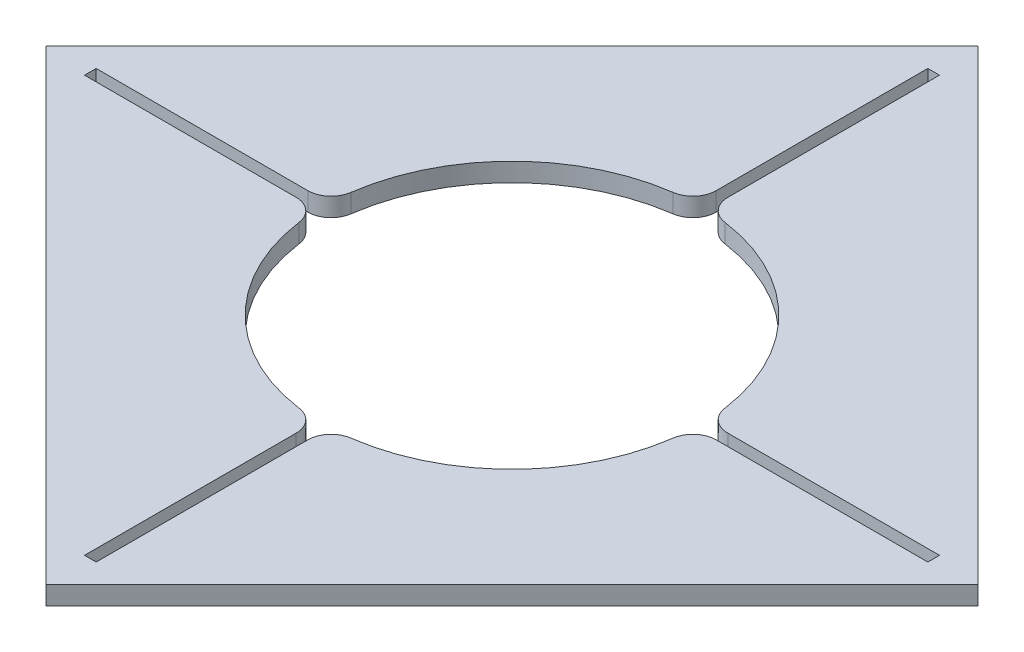
ISO-10303-21;
HEADER;
FILE_DESCRIPTION(('STEP AP214'),'2;1');
FILE_NAME('part.step','',(''),(''),'','','');
FILE_SCHEMA(('AUTOMOTIVE_DESIGN { 1 0 10303 214 1 1 1 1 }'));
ENDSEC;
DATA;
#1=APPLICATION_CONTEXT('core data for automotive mechanical design processes');
#2=APPLICATION_PROTOCOL_DEFINITION('international standard','automotive_design',2000,#1);
#3=PRODUCT_CONTEXT('',#1,'mechanical');
#4=PRODUCT('Part','Part','',(#3));
#5=PRODUCT_RELATED_PRODUCT_CATEGORY('part','',(#4));
#6=PRODUCT_DEFINITION_FORMATION('','',#4);
#7=PRODUCT_DEFINITION_CONTEXT('part definition',#1,'design');
#8=PRODUCT_DEFINITION('design','',#6,#7);
#9=PRODUCT_DEFINITION_SHAPE('','',#8);
#10=(LENGTH_UNIT() NAMED_UNIT(*) SI_UNIT(.MILLI.,.METRE.));
#11=(NAMED_UNIT(*) PLANE_ANGLE_UNIT() SI_UNIT($,.RADIAN.));
#12=(NAMED_UNIT(*) SI_UNIT($,.STERADIAN.) SOLID_ANGLE_UNIT());
#13=UNCERTAINTY_MEASURE_WITH_UNIT(LENGTH_MEASURE(1.E-05),#10,'distance_accuracy_value','');
#14=(GEOMETRIC_REPRESENTATION_CONTEXT(3) GLOBAL_UNCERTAINTY_ASSIGNED_CONTEXT((#13)) GLOBAL_UNIT_ASSIGNED_CONTEXT((#10,
#11,#12)) REPRESENTATION_CONTEXT('',''));
#15=CARTESIAN_POINT('',(0.,0.,0.));
#16=DIRECTION('',(0.,0.,1.));
#17=DIRECTION('',(1.,0.,0.));
#18=AXIS2_PLACEMENT_3D('',#15,#16,#17);
#19=CARTESIAN_POINT('',(0.,5.08,0.));
#20=DIRECTION('',(0.,-1.,0.));
#21=DIRECTION('',(0.,0.,-1.));
#22=AXIS2_PLACEMENT_3D('',#19,#20,#21);
#23=CYLINDRICAL_SURFACE('',#22,51.435);
#24=CARTESIAN_POINT('',(0.,0.,0.));
#25=DIRECTION('',(0.,1.,0.));
#26=DIRECTION('',(0.,0.,1.));
#27=AXIS2_PLACEMENT_3D('',#24,#25,#26);
#28=CIRCLE('',#27,51.435);
#29=CARTESIAN_POINT('',(7.06524725274725,0.,50.9474386623856));
#30=VERTEX_POINT('',#29);
#31=CARTESIAN_POINT('',(50.9474386623856,0.,7.06524725274726));
#32=VERTEX_POINT('',#31);
#33=EDGE_CURVE('E270',#30,#32,#28,.T.);
#34=ORIENTED_EDGE('',*,*,#33,.F.);
#35=DIRECTION('',(0.,-1.,0.));
#36=VECTOR('',#35,1.);
#37=CARTESIAN_POINT('',(7.06524725274725,5.08,50.9474386623856));
#38=LINE('',#37,#36);
#39=CARTESIAN_POINT('',(7.06524725274725,5.08,50.9474386623856));
#40=VERTEX_POINT('',#39);
#41=EDGE_CURVE('E11',#40,#30,#38,.T.);
#42=ORIENTED_EDGE('',*,*,#41,.F.);
#43=CARTESIAN_POINT('',(0.,5.08,0.));
#44=DIRECTION('',(0.,1.,0.));
#45=DIRECTION('',(0.,0.,1.));
#46=AXIS2_PLACEMENT_3D('',#43,#44,#45);
#47=CIRCLE('',#46,51.435);
#48=CARTESIAN_POINT('',(50.9474386623856,5.08,7.06524725274726));
#49=VERTEX_POINT('',#48);
#50=EDGE_CURVE('E405',#40,#49,#47,.T.);
#51=ORIENTED_EDGE('',*,*,#50,.T.);
#52=DIRECTION('',(0.,-1.,0.));
#53=VECTOR('',#52,1.);
#54=CARTESIAN_POINT('',(50.9474386623856,5.08,7.06524725274726));
#55=LINE('',#54,#53);
#56=EDGE_CURVE('E147',#49,#32,#55,.T.);
#57=ORIENTED_EDGE('',*,*,#56,.T.);
#58=EDGE_LOOP('',(#34,#42,#51,#57));
#59=FACE_BOUND('',#58,.T.);
#60=ADVANCED_FACE('F33',(#59),#23,.F.);
#61=CARTESIAN_POINT('',(7.9375,5.08,57.2372459046555));
#62=DIRECTION('',(0.,-1.,0.));
#63=DIRECTION('',(0.,0.,-1.));
#64=AXIS2_PLACEMENT_3D('',#61,#62,#63);
#65=CYLINDRICAL_SURFACE('',#64,6.35);
#66=CARTESIAN_POINT('',(7.9375,0.,57.2372459046555));
#67=DIRECTION('',(0.,1.,0.));
#68=DIRECTION('',(0.,0.,1.));
#69=AXIS2_PLACEMENT_3D('',#66,#67,#68);
#70=CIRCLE('',#69,6.35);
#71=CARTESIAN_POINT('',(1.5875,0.,57.2372459046555));
#72=VERTEX_POINT('',#71);
#73=EDGE_CURVE('E272',#30,#72,#70,.T.);
#74=ORIENTED_EDGE('',*,*,#73,.T.);
#75=DIRECTION('',(0.,-1.,0.));
#76=VECTOR('',#75,1.);
#77=CARTESIAN_POINT('',(1.5875,5.08,57.2372459046555));
#78=LINE('',#77,#76);
#79=CARTESIAN_POINT('',(1.5875,5.08,57.2372459046555));
#80=VERTEX_POINT('',#79);
#81=EDGE_CURVE('E43',#80,#72,#78,.T.);
#82=ORIENTED_EDGE('',*,*,#81,.F.);
#83=CARTESIAN_POINT('',(7.9375,5.08,57.2372459046555));
#84=DIRECTION('',(0.,1.,0.));
#85=DIRECTION('',(0.,0.,1.));
#86=AXIS2_PLACEMENT_3D('',#83,#84,#85);
#87=CIRCLE('',#86,6.35);
#88=EDGE_CURVE('E407',#40,#80,#87,.T.);
#89=ORIENTED_EDGE('',*,*,#88,.F.);
#90=ORIENTED_EDGE('',*,*,#41,.T.);
#91=EDGE_LOOP('',(#74,#82,#89,#90));
#92=FACE_BOUND('',#91,.T.);
#93=ADVANCED_FACE('F479',(#92),#65,.T.);
#94=CARTESIAN_POINT('',(1.58749999999997,5.08,0.));
#95=DIRECTION('',(-1.,0.,0.));
#96=DIRECTION('',(0.,0.,1.));
#97=AXIS2_PLACEMENT_3D('',#94,#95,#96);
#98=PLANE('',#97);
#99=DIRECTION('',(0.,0.,-1.));
#100=VECTOR('',#99,1.);
#101=CARTESIAN_POINT('',(1.58749999999997,0.,0.));
#102=LINE('',#101,#100);
#103=CARTESIAN_POINT('',(1.58750000000003,0.,114.91049570613));
#104=VERTEX_POINT('',#103);
#105=EDGE_CURVE('E275',#104,#72,#102,.T.);
#106=ORIENTED_EDGE('',*,*,#105,.F.);
#107=DIRECTION('',(0.,-1.,0.));
#108=VECTOR('',#107,1.);
#109=CARTESIAN_POINT('',(1.58750000000003,5.08,114.91049570613));
#110=LINE('',#109,#108);
#111=CARTESIAN_POINT('',(1.58750000000003,5.08,114.91049570613));
#112=VERTEX_POINT('',#111);
#113=EDGE_CURVE('E377',#112,#104,#110,.T.);
#114=ORIENTED_EDGE('',*,*,#113,.F.);
#115=DIRECTION('',(0.,0.,-1.));
#116=VECTOR('',#115,1.);
#117=CARTESIAN_POINT('',(1.58749999999997,5.08,0.));
#118=LINE('',#117,#116);
#119=EDGE_CURVE('E412',#112,#80,#118,.T.);
#120=ORIENTED_EDGE('',*,*,#119,.T.);
#121=ORIENTED_EDGE('',*,*,#81,.T.);
#122=EDGE_LOOP('',(#106,#114,#120,#121));
#123=FACE_BOUND('',#122,.T.);
#124=ADVANCED_FACE('F484',(#123),#98,.T.);
#125=CARTESIAN_POINT('',(0.,5.08,114.91049570613));
#126=DIRECTION('',(0.,0.,-1.));
#127=DIRECTION('',(-1.,0.,0.));
#128=AXIS2_PLACEMENT_3D('',#125,#126,#127);
#129=PLANE('',#128);
#130=DIRECTION('',(1.,0.,0.));
#131=VECTOR('',#130,1.);
#132=CARTESIAN_POINT('',(0.,0.,114.91049570613));
#133=LINE('',#132,#131);
#134=CARTESIAN_POINT('',(-1.58749999999997,0.,114.91049570613));
#135=VERTEX_POINT('',#134);
#136=EDGE_CURVE('E278',#135,#104,#133,.T.);
#137=ORIENTED_EDGE('',*,*,#136,.F.);
#138=DIRECTION('',(0.,-1.,0.));
#139=VECTOR('',#138,1.);
#140=CARTESIAN_POINT('',(-1.58749999999997,5.08,114.91049570613));
#141=LINE('',#140,#139);
#142=CARTESIAN_POINT('',(-1.58749999999997,5.08,114.91049570613));
#143=VERTEX_POINT('',#142);
#144=EDGE_CURVE('E375',#143,#135,#141,.T.);
#145=ORIENTED_EDGE('',*,*,#144,.F.);
#146=DIRECTION('',(1.,0.,0.));
#147=VECTOR('',#146,1.);
#148=CARTESIAN_POINT('',(0.,5.08,114.91049570613));
#149=LINE('',#148,#147);
#150=EDGE_CURVE('E415',#143,#112,#149,.T.);
#151=ORIENTED_EDGE('',*,*,#150,.T.);
#152=ORIENTED_EDGE('',*,*,#113,.T.);
#153=EDGE_LOOP('',(#137,#145,#151,#152));
#154=FACE_BOUND('',#153,.T.);
#155=ADVANCED_FACE('F568',(#154),#129,.T.);
#156=CARTESIAN_POINT('',(-1.58750000000003,5.08,0.));
#157=DIRECTION('',(-1.,0.,0.));
#158=DIRECTION('',(0.,0.,1.));
#159=AXIS2_PLACEMENT_3D('',#156,#157,#158);
#160=PLANE('',#159);
#161=DIRECTION('',(0.,0.,-1.));
#162=VECTOR('',#161,1.);
#163=CARTESIAN_POINT('',(-1.58750000000003,0.,0.));
#164=LINE('',#163,#162);
#165=CARTESIAN_POINT('',(-1.5875,0.,57.2372459046555));
#166=VERTEX_POINT('',#165);
#167=EDGE_CURVE('E281',#135,#166,#164,.T.);
#168=ORIENTED_EDGE('',*,*,#167,.T.);
#169=DIRECTION('',(0.,-1.,0.));
#170=VECTOR('',#169,1.);
#171=CARTESIAN_POINT('',(-1.5875,5.08,57.2372459046555));
#172=LINE('',#171,#170);
#173=CARTESIAN_POINT('',(-1.5875,5.08,57.2372459046555));
#174=VERTEX_POINT('',#173);
#175=EDGE_CURVE('E372',#174,#166,#172,.T.);
#176=ORIENTED_EDGE('',*,*,#175,.F.);
#177=DIRECTION('',(0.,0.,-1.));
#178=VECTOR('',#177,1.);
#179=CARTESIAN_POINT('',(-1.58750000000003,5.08,0.));
#180=LINE('',#179,#178);
#181=EDGE_CURVE('E418',#143,#174,#180,.T.);
#182=ORIENTED_EDGE('',*,*,#181,.F.);
#183=ORIENTED_EDGE('',*,*,#144,.T.);
#184=EDGE_LOOP('',(#168,#176,#182,#183));
#185=FACE_BOUND('',#184,.T.);
#186=ADVANCED_FACE('F564',(#185),#160,.F.);
#187=CARTESIAN_POINT('',(-7.9375,5.08,57.2372459046555));
#188=DIRECTION('',(0.,-1.,0.));
#189=DIRECTION('',(0.,0.,-1.));
#190=AXIS2_PLACEMENT_3D('',#187,#188,#189);
#191=CYLINDRICAL_SURFACE('',#190,6.35);
#192=CARTESIAN_POINT('',(-7.9375,0.,57.2372459046555));
#193=DIRECTION('',(0.,1.,0.));
#194=DIRECTION('',(0.,0.,1.));
#195=AXIS2_PLACEMENT_3D('',#192,#193,#194);
#196=CIRCLE('',#195,6.35);
#197=CARTESIAN_POINT('',(-7.06524725274727,0.,50.9474386623856));
#198=VERTEX_POINT('',#197);
#199=EDGE_CURVE('E284',#166,#198,#196,.T.);
#200=ORIENTED_EDGE('',*,*,#199,.T.);
#201=DIRECTION('',(0.,-1.,0.));
#202=VECTOR('',#201,1.);
#203=CARTESIAN_POINT('',(-7.06524725274727,5.08,50.9474386623856));
#204=LINE('',#203,#202);
#205=CARTESIAN_POINT('',(-7.06524725274727,5.08,50.9474386623856));
#206=VERTEX_POINT('',#205);
#207=EDGE_CURVE('E370',#206,#198,#204,.T.);
#208=ORIENTED_EDGE('',*,*,#207,.F.);
#209=CARTESIAN_POINT('',(-7.9375,5.08,57.2372459046555));
#210=DIRECTION('',(0.,1.,0.));
#211=DIRECTION('',(0.,0.,1.));
#212=AXIS2_PLACEMENT_3D('',#209,#210,#211);
#213=CIRCLE('',#212,6.35);
#214=EDGE_CURVE('E421',#174,#206,#213,.T.);
#215=ORIENTED_EDGE('',*,*,#214,.F.);
#216=ORIENTED_EDGE('',*,*,#175,.T.);
#217=EDGE_LOOP('',(#200,#208,#215,#216));
#218=FACE_BOUND('',#217,.T.);
#219=ADVANCED_FACE('F560',(#218),#191,.T.);
#220=CARTESIAN_POINT('',(0.,5.08,0.));
#221=DIRECTION('',(0.,-1.,0.));
#222=DIRECTION('',(0.,0.,-1.));
#223=AXIS2_PLACEMENT_3D('',#220,#221,#222);
#224=CYLINDRICAL_SURFACE('',#223,51.435);
#225=CARTESIAN_POINT('',(0.,0.,0.));
#226=DIRECTION('',(0.,1.,0.));
#227=DIRECTION('',(0.,0.,1.));
#228=AXIS2_PLACEMENT_3D('',#225,#226,#227);
#229=CIRCLE('',#228,51.435);
#230=CARTESIAN_POINT('',(-50.9474386623856,0.,7.06524725274725));
#231=VERTEX_POINT('',#230);
#232=EDGE_CURVE('E287',#231,#198,#229,.T.);
#233=ORIENTED_EDGE('',*,*,#232,.F.);
#234=DIRECTION('',(0.,-1.,0.));
#235=VECTOR('',#234,1.);
#236=CARTESIAN_POINT('',(-50.9474386623856,5.08,7.06524725274725));
#237=LINE('',#236,#235);
#238=CARTESIAN_POINT('',(-50.9474386623856,5.08,7.06524725274725));
#239=VERTEX_POINT('',#238);
#240=EDGE_CURVE('E368',#239,#231,#237,.T.);
#241=ORIENTED_EDGE('',*,*,#240,.F.);
#242=CARTESIAN_POINT('',(0.,5.08,0.));
#243=DIRECTION('',(0.,1.,0.));
#244=DIRECTION('',(0.,0.,1.));
#245=AXIS2_PLACEMENT_3D('',#242,#243,#244);
#246=CIRCLE('',#245,51.435);
#247=EDGE_CURVE('E423',#239,#206,#246,.T.);
#248=ORIENTED_EDGE('',*,*,#247,.T.);
#249=ORIENTED_EDGE('',*,*,#207,.T.);
#250=EDGE_LOOP('',(#233,#241,#248,#249));
#251=FACE_BOUND('',#250,.T.);
#252=ADVANCED_FACE('F556',(#251),#224,.F.);
#253=CARTESIAN_POINT('',(-57.2372459046555,5.08,7.9375));
#254=DIRECTION('',(0.,-1.,0.));
#255=DIRECTION('',(0.,0.,-1.));
#256=AXIS2_PLACEMENT_3D('',#253,#254,#255);
#257=CYLINDRICAL_SURFACE('',#256,6.35);
#258=CARTESIAN_POINT('',(-57.2372459046555,0.,7.9375));
#259=DIRECTION('',(0.,1.,0.));
#260=DIRECTION('',(0.,0.,1.));
#261=AXIS2_PLACEMENT_3D('',#258,#259,#260);
#262=CIRCLE('',#261,6.35);
#263=CARTESIAN_POINT('',(-57.2372459046555,0.,1.5875));
#264=VERTEX_POINT('',#263);
#265=EDGE_CURVE('E290',#264,#231,#262,.F.);
#266=ORIENTED_EDGE('',*,*,#265,.F.);
#267=DIRECTION('',(0.,-1.,0.));
#268=VECTOR('',#267,1.);
#269=CARTESIAN_POINT('',(-57.2372459046555,5.08,1.5875));
#270=LINE('',#269,#268);
#271=CARTESIAN_POINT('',(-57.2372459046555,5.08,1.5875));
#272=VERTEX_POINT('',#271);
#273=EDGE_CURVE('E366',#272,#264,#270,.T.);
#274=ORIENTED_EDGE('',*,*,#273,.F.);
#275=CARTESIAN_POINT('',(-57.2372459046555,5.08,7.9375));
#276=DIRECTION('',(0.,1.,0.));
#277=DIRECTION('',(0.,0.,1.));
#278=AXIS2_PLACEMENT_3D('',#275,#276,#277);
#279=CIRCLE('',#278,6.35);
#280=EDGE_CURVE('E426',#272,#239,#279,.F.);
#281=ORIENTED_EDGE('',*,*,#280,.T.);
#282=ORIENTED_EDGE('',*,*,#240,.T.);
#283=EDGE_LOOP('',(#266,#274,#281,#282));
#284=FACE_BOUND('',#283,.T.);
#285=ADVANCED_FACE('F552',(#284),#257,.T.);
#286=CARTESIAN_POINT('',(0.,5.08,1.5875));
#287=DIRECTION('',(0.,0.,-1.));
#288=DIRECTION('',(-1.,0.,0.));
#289=AXIS2_PLACEMENT_3D('',#286,#287,#288);
#290=PLANE('',#289);
#291=DIRECTION('',(1.,0.,0.));
#292=VECTOR('',#291,1.);
#293=CARTESIAN_POINT('',(0.,0.,1.5875));
#294=LINE('',#293,#292);
#295=CARTESIAN_POINT('',(-114.91049570613,0.,1.5875));
#296=VERTEX_POINT('',#295);
#297=EDGE_CURVE('E293',#296,#264,#294,.T.);
#298=ORIENTED_EDGE('',*,*,#297,.F.);
#299=DIRECTION('',(0.,-1.,0.));
#300=VECTOR('',#299,1.);
#301=CARTESIAN_POINT('',(-114.91049570613,5.08,1.5875));
#302=LINE('',#301,#300);
#303=CARTESIAN_POINT('',(-114.91049570613,5.08,1.5875));
#304=VERTEX_POINT('',#303);
#305=EDGE_CURVE('E364',#304,#296,#302,.T.);
#306=ORIENTED_EDGE('',*,*,#305,.F.);
#307=DIRECTION('',(1.,0.,0.));
#308=VECTOR('',#307,1.);
#309=CARTESIAN_POINT('',(0.,5.08,1.5875));
#310=LINE('',#309,#308);
#311=EDGE_CURVE('E429',#304,#272,#310,.T.);
#312=ORIENTED_EDGE('',*,*,#311,.T.);
#313=ORIENTED_EDGE('',*,*,#273,.T.);
#314=EDGE_LOOP('',(#298,#306,#312,#313));
#315=FACE_BOUND('',#314,.T.);
#316=ADVANCED_FACE('F548',(#315),#290,.T.);
#317=CARTESIAN_POINT('',(-114.91049570613,5.08,0.));
#318=DIRECTION('',(1.,0.,0.));
#319=DIRECTION('',(0.,0.,-1.));
#320=AXIS2_PLACEMENT_3D('',#317,#318,#319);
#321=PLANE('',#320);
#322=DIRECTION('',(0.,0.,1.));
#323=VECTOR('',#322,1.);
#324=CARTESIAN_POINT('',(-114.91049570613,0.,0.));
#325=LINE('',#324,#323);
#326=CARTESIAN_POINT('',(-114.91049570613,0.,-1.5875));
#327=VERTEX_POINT('',#326);
#328=EDGE_CURVE('E296',#327,#296,#325,.T.);
#329=ORIENTED_EDGE('',*,*,#328,.F.);
#330=DIRECTION('',(0.,-1.,0.));
#331=VECTOR('',#330,1.);
#332=CARTESIAN_POINT('',(-114.91049570613,5.08,-1.5875));
#333=LINE('',#332,#331);
#334=CARTESIAN_POINT('',(-114.91049570613,5.08,-1.5875));
#335=VERTEX_POINT('',#334);
#336=EDGE_CURVE('E362',#335,#327,#333,.T.);
#337=ORIENTED_EDGE('',*,*,#336,.F.);
#338=DIRECTION('',(0.,0.,1.));
#339=VECTOR('',#338,1.);
#340=CARTESIAN_POINT('',(-114.91049570613,5.08,0.));
#341=LINE('',#340,#339);
#342=EDGE_CURVE('E432',#335,#304,#341,.T.);
#343=ORIENTED_EDGE('',*,*,#342,.T.);
#344=ORIENTED_EDGE('',*,*,#305,.T.);
#345=EDGE_LOOP('',(#329,#337,#343,#344));
#346=FACE_BOUND('',#345,.T.);
#347=ADVANCED_FACE('F544',(#346),#321,.T.);
#348=CARTESIAN_POINT('',(0.,5.08,-1.5875));
#349=DIRECTION('',(0.,0.,-1.));
#350=DIRECTION('',(-1.,0.,0.));
#351=AXIS2_PLACEMENT_3D('',#348,#349,#350);
#352=PLANE('',#351);
#353=DIRECTION('',(1.,0.,0.));
#354=VECTOR('',#353,1.);
#355=CARTESIAN_POINT('',(0.,0.,-1.5875));
#356=LINE('',#355,#354);
#357=CARTESIAN_POINT('',(-57.2372459046555,0.,-1.5875));
#358=VERTEX_POINT('',#357);
#359=EDGE_CURVE('E299',#327,#358,#356,.T.);
#360=ORIENTED_EDGE('',*,*,#359,.T.);
#361=DIRECTION('',(0.,-1.,0.));
#362=VECTOR('',#361,1.);
#363=CARTESIAN_POINT('',(-57.2372459046555,5.08,-1.5875));
#364=LINE('',#363,#362);
#365=CARTESIAN_POINT('',(-57.2372459046555,5.08,-1.5875));
#366=VERTEX_POINT('',#365);
#367=EDGE_CURVE('E359',#366,#358,#364,.T.);
#368=ORIENTED_EDGE('',*,*,#367,.F.);
#369=DIRECTION('',(1.,0.,0.));
#370=VECTOR('',#369,1.);
#371=CARTESIAN_POINT('',(0.,5.08,-1.5875));
#372=LINE('',#371,#370);
#373=EDGE_CURVE('E435',#335,#366,#372,.T.);
#374=ORIENTED_EDGE('',*,*,#373,.F.);
#375=ORIENTED_EDGE('',*,*,#336,.T.);
#376=EDGE_LOOP('',(#360,#368,#374,#375));
#377=FACE_BOUND('',#376,.T.);
#378=ADVANCED_FACE('F540',(#377),#352,.F.);
#379=CARTESIAN_POINT('',(-57.2372459046555,5.08,-7.9375));
#380=DIRECTION('',(0.,-1.,0.));
#381=DIRECTION('',(0.,0.,-1.));
#382=AXIS2_PLACEMENT_3D('',#379,#380,#381);
#383=CYLINDRICAL_SURFACE('',#382,6.35);
#384=CARTESIAN_POINT('',(-57.2372459046555,0.,-7.9375));
#385=DIRECTION('',(0.,1.,0.));
#386=DIRECTION('',(0.,0.,1.));
#387=AXIS2_PLACEMENT_3D('',#384,#385,#386);
#388=CIRCLE('',#387,6.35);
#389=CARTESIAN_POINT('',(-50.9474386623856,0.,-7.06524725274726));
#390=VERTEX_POINT('',#389);
#391=EDGE_CURVE('E302',#358,#390,#388,.T.);
#392=ORIENTED_EDGE('',*,*,#391,.T.);
#393=DIRECTION('',(0.,-1.,0.));
#394=VECTOR('',#393,1.);
#395=CARTESIAN_POINT('',(-50.9474386623856,5.08,-7.06524725274726));
#396=LINE('',#395,#394);
#397=CARTESIAN_POINT('',(-50.9474386623856,5.08,-7.06524725274726));
#398=VERTEX_POINT('',#397);
#399=EDGE_CURVE('E357',#398,#390,#396,.T.);
#400=ORIENTED_EDGE('',*,*,#399,.F.);
#401=CARTESIAN_POINT('',(-57.2372459046555,5.08,-7.9375));
#402=DIRECTION('',(0.,1.,0.));
#403=DIRECTION('',(0.,0.,1.));
#404=AXIS2_PLACEMENT_3D('',#401,#402,#403);
#405=CIRCLE('',#404,6.35);
#406=EDGE_CURVE('E438',#366,#398,#405,.T.);
#407=ORIENTED_EDGE('',*,*,#406,.F.);
#408=ORIENTED_EDGE('',*,*,#367,.T.);
#409=EDGE_LOOP('',(#392,#400,#407,#408));
#410=FACE_BOUND('',#409,.T.);
#411=ADVANCED_FACE('F536',(#410),#383,.T.);
#412=CARTESIAN_POINT('',(0.,5.08,0.));
#413=DIRECTION('',(0.,-1.,0.));
#414=DIRECTION('',(0.,0.,-1.));
#415=AXIS2_PLACEMENT_3D('',#412,#413,#414);
#416=CYLINDRICAL_SURFACE('',#415,51.435);
#417=CARTESIAN_POINT('',(0.,0.,0.));
#418=DIRECTION('',(0.,1.,0.));
#419=DIRECTION('',(0.,0.,1.));
#420=AXIS2_PLACEMENT_3D('',#417,#418,#419);
#421=CIRCLE('',#420,51.435);
#422=CARTESIAN_POINT('',(-7.06524725274725,0.,-50.9474386623856));
#423=VERTEX_POINT('',#422);
#424=EDGE_CURVE('E305',#423,#390,#421,.T.);
#425=ORIENTED_EDGE('',*,*,#424,.F.);
#426=DIRECTION('',(0.,-1.,0.));
#427=VECTOR('',#426,1.);
#428=CARTESIAN_POINT('',(-7.06524725274725,5.08,-50.9474386623856));
#429=LINE('',#428,#427);
#430=CARTESIAN_POINT('',(-7.06524725274725,5.08,-50.9474386623856));
#431=VERTEX_POINT('',#430);
#432=EDGE_CURVE('E355',#431,#423,#429,.T.);
#433=ORIENTED_EDGE('',*,*,#432,.F.);
#434=CARTESIAN_POINT('',(0.,5.08,0.));
#435=DIRECTION('',(0.,1.,0.));
#436=DIRECTION('',(0.,0.,1.));
#437=AXIS2_PLACEMENT_3D('',#434,#435,#436);
#438=CIRCLE('',#437,51.435);
#439=EDGE_CURVE('E440',#431,#398,#438,.T.);
#440=ORIENTED_EDGE('',*,*,#439,.T.);
#441=ORIENTED_EDGE('',*,*,#399,.T.);
#442=EDGE_LOOP('',(#425,#433,#440,#441));
#443=FACE_BOUND('',#442,.T.);
#444=ADVANCED_FACE('F532',(#443),#416,.F.);
#445=CARTESIAN_POINT('',(-7.9375,5.08,-57.2372459046555));
#446=DIRECTION('',(0.,-1.,0.));
#447=DIRECTION('',(0.,0.,-1.));
#448=AXIS2_PLACEMENT_3D('',#445,#446,#447);
#449=CYLINDRICAL_SURFACE('',#448,6.35);
#450=CARTESIAN_POINT('',(-7.9375,0.,-57.2372459046555));
#451=DIRECTION('',(0.,1.,0.));
#452=DIRECTION('',(0.,0.,1.));
#453=AXIS2_PLACEMENT_3D('',#450,#451,#452);
#454=CIRCLE('',#453,6.35);
#455=CARTESIAN_POINT('',(-1.5875,0.,-57.2372459046555));
#456=VERTEX_POINT('',#455);
#457=EDGE_CURVE('E308',#456,#423,#454,.F.);
#458=ORIENTED_EDGE('',*,*,#457,.F.);
#459=DIRECTION('',(0.,-1.,0.));
#460=VECTOR('',#459,1.);
#461=CARTESIAN_POINT('',(-1.5875,5.08,-57.2372459046555));
#462=LINE('',#461,#460);
#463=CARTESIAN_POINT('',(-1.5875,5.08,-57.2372459046555));
#464=VERTEX_POINT('',#463);
#465=EDGE_CURVE('E353',#464,#456,#462,.T.);
#466=ORIENTED_EDGE('',*,*,#465,.F.);
#467=CARTESIAN_POINT('',(-7.9375,5.08,-57.2372459046555));
#468=DIRECTION('',(0.,1.,0.));
#469=DIRECTION('',(0.,0.,1.));
#470=AXIS2_PLACEMENT_3D('',#467,#468,#469);
#471=CIRCLE('',#470,6.35);
#472=EDGE_CURVE('E443',#464,#431,#471,.F.);
#473=ORIENTED_EDGE('',*,*,#472,.T.);
#474=ORIENTED_EDGE('',*,*,#432,.T.);
#475=EDGE_LOOP('',(#458,#466,#473,#474));
#476=FACE_BOUND('',#475,.T.);
#477=ADVANCED_FACE('F528',(#476),#449,.T.);
#478=CARTESIAN_POINT('',(-1.5875,5.08,0.));
#479=DIRECTION('',(1.,0.,0.));
#480=DIRECTION('',(0.,0.,-1.));
#481=AXIS2_PLACEMENT_3D('',#478,#479,#480);
#482=PLANE('',#481);
#483=DIRECTION('',(0.,0.,1.));
#484=VECTOR('',#483,1.);
#485=CARTESIAN_POINT('',(-1.5875,0.,0.));
#486=LINE('',#485,#484);
#487=CARTESIAN_POINT('',(-1.5875,0.,-114.91049570613));
#488=VERTEX_POINT('',#487);
#489=EDGE_CURVE('E311',#488,#456,#486,.T.);
#490=ORIENTED_EDGE('',*,*,#489,.F.);
#491=DIRECTION('',(0.,-1.,0.));
#492=VECTOR('',#491,1.);
#493=CARTESIAN_POINT('',(-1.5875,5.08,-114.91049570613));
#494=LINE('',#493,#492);
#495=CARTESIAN_POINT('',(-1.5875,5.08,-114.91049570613));
#496=VERTEX_POINT('',#495);
#497=EDGE_CURVE('E351',#496,#488,#494,.T.);
#498=ORIENTED_EDGE('',*,*,#497,.F.);
#499=DIRECTION('',(0.,0.,1.));
#500=VECTOR('',#499,1.);
#501=CARTESIAN_POINT('',(-1.5875,5.08,0.));
#502=LINE('',#501,#500);
#503=EDGE_CURVE('E446',#496,#464,#502,.T.);
#504=ORIENTED_EDGE('',*,*,#503,.T.);
#505=ORIENTED_EDGE('',*,*,#465,.T.);
#506=EDGE_LOOP('',(#490,#498,#504,#505));
#507=FACE_BOUND('',#506,.T.);
#508=ADVANCED_FACE('F524',(#507),#482,.T.);
#509=CARTESIAN_POINT('',(0.,5.08,-114.91049570613));
#510=DIRECTION('',(0.,0.,-1.));
#511=DIRECTION('',(-1.,0.,0.));
#512=AXIS2_PLACEMENT_3D('',#509,#510,#511);
#513=PLANE('',#512);
#514=DIRECTION('',(1.,0.,0.));
#515=VECTOR('',#514,1.);
#516=CARTESIAN_POINT('',(0.,0.,-114.91049570613));
#517=LINE('',#516,#515);
#518=CARTESIAN_POINT('',(1.5875,0.,-114.91049570613));
#519=VERTEX_POINT('',#518);
#520=EDGE_CURVE('E314',#488,#519,#517,.T.);
#521=ORIENTED_EDGE('',*,*,#520,.T.);
#522=DIRECTION('',(0.,-1.,0.));
#523=VECTOR('',#522,1.);
#524=CARTESIAN_POINT('',(1.5875,5.08,-114.91049570613));
#525=LINE('',#524,#523);
#526=CARTESIAN_POINT('',(1.5875,5.08,-114.91049570613));
#527=VERTEX_POINT('',#526);
#528=EDGE_CURVE('E348',#527,#519,#525,.T.);
#529=ORIENTED_EDGE('',*,*,#528,.F.);
#530=DIRECTION('',(1.,0.,0.));
#531=VECTOR('',#530,1.);
#532=CARTESIAN_POINT('',(0.,5.08,-114.91049570613));
#533=LINE('',#532,#531);
#534=EDGE_CURVE('E449',#496,#527,#533,.T.);
#535=ORIENTED_EDGE('',*,*,#534,.F.);
#536=ORIENTED_EDGE('',*,*,#497,.T.);
#537=EDGE_LOOP('',(#521,#529,#535,#536));
#538=FACE_BOUND('',#537,.T.);
#539=ADVANCED_FACE('F520',(#538),#513,.F.);
#540=CARTESIAN_POINT('',(1.5875,5.08,0.));
#541=DIRECTION('',(1.,0.,0.));
#542=DIRECTION('',(0.,0.,-1.));
#543=AXIS2_PLACEMENT_3D('',#540,#541,#542);
#544=PLANE('',#543);
#545=DIRECTION('',(0.,0.,1.));
#546=VECTOR('',#545,1.);
#547=CARTESIAN_POINT('',(1.5875,0.,0.));
#548=LINE('',#547,#546);
#549=CARTESIAN_POINT('',(1.5875,0.,-57.2372459046555));
#550=VERTEX_POINT('',#549);
#551=EDGE_CURVE('E317',#519,#550,#548,.T.);
#552=ORIENTED_EDGE('',*,*,#551,.T.);
#553=DIRECTION('',(0.,-1.,0.));
#554=VECTOR('',#553,1.);
#555=CARTESIAN_POINT('',(1.5875,5.08,-57.2372459046555));
#556=LINE('',#555,#554);
#557=CARTESIAN_POINT('',(1.5875,5.08,-57.2372459046555));
#558=VERTEX_POINT('',#557);
#559=EDGE_CURVE('E346',#558,#550,#556,.T.);
#560=ORIENTED_EDGE('',*,*,#559,.F.);
#561=DIRECTION('',(0.,0.,1.));
#562=VECTOR('',#561,1.);
#563=CARTESIAN_POINT('',(1.5875,5.08,0.));
#564=LINE('',#563,#562);
#565=EDGE_CURVE('E452',#527,#558,#564,.T.);
#566=ORIENTED_EDGE('',*,*,#565,.F.);
#567=ORIENTED_EDGE('',*,*,#528,.T.);
#568=EDGE_LOOP('',(#552,#560,#566,#567));
#569=FACE_BOUND('',#568,.T.);
#570=ADVANCED_FACE('F516',(#569),#544,.F.);
#571=CARTESIAN_POINT('',(7.9375,5.08,-57.2372459046555));
#572=DIRECTION('',(0.,-1.,0.));
#573=DIRECTION('',(0.,0.,-1.));
#574=AXIS2_PLACEMENT_3D('',#571,#572,#573);
#575=CYLINDRICAL_SURFACE('',#574,6.35);
#576=CARTESIAN_POINT('',(7.9375,0.,-57.2372459046555));
#577=DIRECTION('',(0.,1.,0.));
#578=DIRECTION('',(0.,0.,1.));
#579=AXIS2_PLACEMENT_3D('',#576,#577,#578);
#580=CIRCLE('',#579,6.35);
#581=CARTESIAN_POINT('',(7.06524725274726,0.,-50.9474386623856));
#582=VERTEX_POINT('',#581);
#583=EDGE_CURVE('E320',#582,#550,#580,.F.);
#584=ORIENTED_EDGE('',*,*,#583,.F.);
#585=DIRECTION('',(0.,-1.,0.));
#586=VECTOR('',#585,1.);
#587=CARTESIAN_POINT('',(7.06524725274726,5.08,-50.9474386623856));
#588=LINE('',#587,#586);
#589=CARTESIAN_POINT('',(7.06524725274726,5.08,-50.9474386623856));
#590=VERTEX_POINT('',#589);
#591=EDGE_CURVE('E344',#590,#582,#588,.T.);
#592=ORIENTED_EDGE('',*,*,#591,.F.);
#593=CARTESIAN_POINT('',(7.9375,5.08,-57.2372459046555));
#594=DIRECTION('',(0.,1.,0.));
#595=DIRECTION('',(0.,0.,1.));
#596=AXIS2_PLACEMENT_3D('',#593,#594,#595);
#597=CIRCLE('',#596,6.35);
#598=EDGE_CURVE('E454',#590,#558,#597,.F.);
#599=ORIENTED_EDGE('',*,*,#598,.T.);
#600=ORIENTED_EDGE('',*,*,#559,.T.);
#601=EDGE_LOOP('',(#584,#592,#599,#600));
#602=FACE_BOUND('',#601,.T.);
#603=ADVANCED_FACE('F512',(#602),#575,.T.);
#604=CARTESIAN_POINT('',(0.,5.08,0.));
#605=DIRECTION('',(0.,-1.,0.));
#606=DIRECTION('',(0.,0.,-1.));
#607=AXIS2_PLACEMENT_3D('',#604,#605,#606);
#608=CYLINDRICAL_SURFACE('',#607,51.435);
#609=CARTESIAN_POINT('',(0.,0.,0.));
#610=DIRECTION('',(0.,1.,0.));
#611=DIRECTION('',(0.,0.,1.));
#612=AXIS2_PLACEMENT_3D('',#609,#610,#611);
#613=CIRCLE('',#612,51.435);
#614=CARTESIAN_POINT('',(50.9474386623856,0.,-7.06524725274725));
#615=VERTEX_POINT('',#614);
#616=EDGE_CURVE('E323',#615,#582,#613,.T.);
#617=ORIENTED_EDGE('',*,*,#616,.F.);
#618=DIRECTION('',(0.,-1.,0.));
#619=VECTOR('',#618,1.);
#620=CARTESIAN_POINT('',(50.9474386623856,5.08,-7.06524725274725));
#621=LINE('',#620,#619);
#622=CARTESIAN_POINT('',(50.9474386623856,5.08,-7.06524725274725));
#623=VERTEX_POINT('',#622);
#624=EDGE_CURVE('E342',#623,#615,#621,.T.);
#625=ORIENTED_EDGE('',*,*,#624,.F.);
#626=CARTESIAN_POINT('',(0.,5.08,0.));
#627=DIRECTION('',(0.,1.,0.));
#628=DIRECTION('',(0.,0.,1.));
#629=AXIS2_PLACEMENT_3D('',#626,#627,#628);
#630=CIRCLE('',#629,51.435);
#631=EDGE_CURVE('E457',#623,#590,#630,.T.);
#632=ORIENTED_EDGE('',*,*,#631,.T.);
#633=ORIENTED_EDGE('',*,*,#591,.T.);
#634=EDGE_LOOP('',(#617,#625,#632,#633));
#635=FACE_BOUND('',#634,.T.);
#636=ADVANCED_FACE('F509',(#635),#608,.F.);
#637=CARTESIAN_POINT('',(57.2372459046555,5.08,-7.9375));
#638=DIRECTION('',(0.,-1.,0.));
#639=DIRECTION('',(0.,0.,-1.));
#640=AXIS2_PLACEMENT_3D('',#637,#638,#639);
#641=CYLINDRICAL_SURFACE('',#640,6.35);
#642=CARTESIAN_POINT('',(57.2372459046555,0.,-7.9375));
#643=DIRECTION('',(0.,1.,0.));
#644=DIRECTION('',(0.,0.,1.));
#645=AXIS2_PLACEMENT_3D('',#642,#643,#644);
#646=CIRCLE('',#645,6.35);
#647=CARTESIAN_POINT('',(57.2372459046555,0.,-1.5875));
#648=VERTEX_POINT('',#647);
#649=EDGE_CURVE('E326',#648,#615,#646,.F.);
#650=ORIENTED_EDGE('',*,*,#649,.F.);
#651=DIRECTION('',(0.,-1.,0.));
#652=VECTOR('',#651,1.);
#653=CARTESIAN_POINT('',(57.2372459046555,5.08,-1.5875));
#654=LINE('',#653,#652);
#655=CARTESIAN_POINT('',(57.2372459046555,5.08,-1.5875));
#656=VERTEX_POINT('',#655);
#657=EDGE_CURVE('E340',#656,#648,#654,.T.);
#658=ORIENTED_EDGE('',*,*,#657,.F.);
#659=CARTESIAN_POINT('',(57.2372459046555,5.08,-7.9375));
#660=DIRECTION('',(0.,1.,0.));
#661=DIRECTION('',(0.,0.,1.));
#662=AXIS2_PLACEMENT_3D('',#659,#660,#661);
#663=CIRCLE('',#662,6.35);
#664=EDGE_CURVE('E252',#656,#623,#663,.F.);
#665=ORIENTED_EDGE('',*,*,#664,.T.);
#666=ORIENTED_EDGE('',*,*,#624,.T.);
#667=EDGE_LOOP('',(#650,#658,#665,#666));
#668=FACE_BOUND('',#667,.T.);
#669=ADVANCED_FACE('F462',(#668),#641,.T.);
#670=CARTESIAN_POINT('',(0.,5.08,-1.5875));
#671=DIRECTION('',(0.,0.,1.));
#672=DIRECTION('',(1.,0.,0.));
#673=AXIS2_PLACEMENT_3D('',#670,#671,#672);
#674=PLANE('',#673);
#675=DIRECTION('',(-1.,0.,0.));
#676=VECTOR('',#675,1.);
#677=CARTESIAN_POINT('',(0.,0.,-1.5875));
#678=LINE('',#677,#676);
#679=CARTESIAN_POINT('',(114.91049570613,0.,-1.5875));
#680=VERTEX_POINT('',#679);
#681=EDGE_CURVE('E329',#680,#648,#678,.T.);
#682=ORIENTED_EDGE('',*,*,#681,.F.);
#683=DIRECTION('',(0.,-1.,0.));
#684=VECTOR('',#683,1.);
#685=CARTESIAN_POINT('',(114.91049570613,5.08,-1.5875));
#686=LINE('',#685,#684);
#687=CARTESIAN_POINT('',(114.91049570613,5.08,-1.5875));
#688=VERTEX_POINT('',#687);
#689=EDGE_CURVE('E239',#688,#680,#686,.T.);
#690=ORIENTED_EDGE('',*,*,#689,.F.);
#691=DIRECTION('',(-1.,0.,0.));
#692=VECTOR('',#691,1.);
#693=CARTESIAN_POINT('',(0.,5.08,-1.5875));
#694=LINE('',#693,#692);
#695=EDGE_CURVE('E250',#688,#656,#694,.T.);
#696=ORIENTED_EDGE('',*,*,#695,.T.);
#697=ORIENTED_EDGE('',*,*,#657,.T.);
#698=EDGE_LOOP('',(#682,#690,#696,#697));
#699=FACE_BOUND('',#698,.T.);
#700=ADVANCED_FACE('F468',(#699),#674,.T.);
#701=CARTESIAN_POINT('',(114.91049570613,5.08,0.));
#702=DIRECTION('',(-1.,0.,0.));
#703=DIRECTION('',(0.,0.,1.));
#704=AXIS2_PLACEMENT_3D('',#701,#702,#703);
#705=PLANE('',#704);
#706=DIRECTION('',(0.,0.,-1.));
#707=VECTOR('',#706,1.);
#708=CARTESIAN_POINT('',(114.91049570613,0.,0.));
#709=LINE('',#708,#707);
#710=CARTESIAN_POINT('',(114.91049570613,0.,1.5875));
#711=VERTEX_POINT('',#710);
#712=EDGE_CURVE('E236',#711,#680,#709,.T.);
#713=ORIENTED_EDGE('',*,*,#712,.F.);
#714=DIRECTION('',(0.,-1.,0.));
#715=VECTOR('',#714,1.);
#716=CARTESIAN_POINT('',(114.91049570613,5.08,1.5875));
#717=LINE('',#716,#715);
#718=CARTESIAN_POINT('',(114.91049570613,5.08,1.5875));
#719=VERTEX_POINT('',#718);
#720=EDGE_CURVE('E230',#719,#711,#717,.T.);
#721=ORIENTED_EDGE('',*,*,#720,.F.);
#722=DIRECTION('',(0.,0.,-1.));
#723=VECTOR('',#722,1.);
#724=CARTESIAN_POINT('',(114.91049570613,5.08,0.));
#725=LINE('',#724,#723);
#726=EDGE_CURVE('E234',#719,#688,#725,.T.);
#727=ORIENTED_EDGE('',*,*,#726,.T.);
#728=ORIENTED_EDGE('',*,*,#689,.T.);
#729=EDGE_LOOP('',(#713,#721,#727,#728));
#730=FACE_BOUND('',#729,.T.);
#731=ADVANCED_FACE('F232',(#730),#705,.T.);
#732=CARTESIAN_POINT('',(0.,5.08,1.5875));
#733=DIRECTION('',(0.,0.,1.));
#734=DIRECTION('',(1.,0.,0.));
#735=AXIS2_PLACEMENT_3D('',#732,#733,#734);
#736=PLANE('',#735);
#737=DIRECTION('',(-1.,0.,0.));
#738=VECTOR('',#737,1.);
#739=CARTESIAN_POINT('',(0.,0.,1.5875));
#740=LINE('',#739,#738);
#741=CARTESIAN_POINT('',(57.2372459046555,0.,1.5875));
#742=VERTEX_POINT('',#741);
#743=EDGE_CURVE('E333',#711,#742,#740,.T.);
#744=ORIENTED_EDGE('',*,*,#743,.T.);
#745=DIRECTION('',(0.,-1.,0.));
#746=VECTOR('',#745,1.);
#747=CARTESIAN_POINT('',(57.2372459046555,5.08,1.5875));
#748=LINE('',#747,#746);
#749=CARTESIAN_POINT('',(57.2372459046555,5.08,1.5875));
#750=VERTEX_POINT('',#749);
#751=EDGE_CURVE('E240',#750,#742,#748,.T.);
#752=ORIENTED_EDGE('',*,*,#751,.F.);
#753=DIRECTION('',(-1.,0.,0.));
#754=VECTOR('',#753,1.);
#755=CARTESIAN_POINT('',(0.,5.08,1.5875));
#756=LINE('',#755,#754);
#757=EDGE_CURVE('E243',#719,#750,#756,.T.);
#758=ORIENTED_EDGE('',*,*,#757,.F.);
#759=ORIENTED_EDGE('',*,*,#720,.T.);
#760=EDGE_LOOP('',(#744,#752,#758,#759));
#761=FACE_BOUND('',#760,.T.);
#762=ADVANCED_FACE('F244',(#761),#736,.F.);
#763=CARTESIAN_POINT('',(-63.5,5.08,-63.5));
#764=DIRECTION('',(-0.707106781186548,0.,-0.707106781186547));
#765=DIRECTION('',(-0.707106781186547,0.,0.707106781186548));
#766=AXIS2_PLACEMENT_3D('',#763,#764,#765);
#767=PLANE('',#766);
#768=DIRECTION('',(0.707106781186547,0.,-0.707106781186548));
#769=VECTOR('',#768,1.);
#770=CARTESIAN_POINT('',(-63.5,0.,-63.5));
#771=LINE('',#770,#769);
#772=CARTESIAN_POINT('',(-127.,0.,0.));
#773=VERTEX_POINT('',#772);
#774=CARTESIAN_POINT('',(0.,0.,-127.));
#775=VERTEX_POINT('',#774);
#776=EDGE_CURVE('E258',#773,#775,#771,.T.);
#777=ORIENTED_EDGE('',*,*,#776,.F.);
#778=DIRECTION('',(0.,-1.,0.));
#779=VECTOR('',#778,1.);
#780=CARTESIAN_POINT('',(-127.,5.08,0.));
#781=LINE('',#780,#779);
#782=CARTESIAN_POINT('',(-127.,5.08,0.));
#783=VERTEX_POINT('',#782);
#784=EDGE_CURVE('E37',#783,#773,#781,.T.);
#785=ORIENTED_EDGE('',*,*,#784,.F.);
#786=DIRECTION('',(0.707106781186547,0.,-0.707106781186548));
#787=VECTOR('',#786,1.);
#788=CARTESIAN_POINT('',(-63.5,5.08,-63.5));
#789=LINE('',#788,#787);
#790=CARTESIAN_POINT('',(0.,5.08,-127.));
#791=VERTEX_POINT('',#790);
#792=EDGE_CURVE('E336',#783,#791,#789,.T.);
#793=ORIENTED_EDGE('',*,*,#792,.T.);
#794=DIRECTION('',(0.,-1.,0.));
#795=VECTOR('',#794,1.);
#796=CARTESIAN_POINT('',(0.,5.08,-127.));
#797=LINE('',#796,#795);
#798=EDGE_CURVE('E257',#791,#775,#797,.T.);
#799=ORIENTED_EDGE('',*,*,#798,.T.);
#800=EDGE_LOOP('',(#777,#785,#793,#799));
#801=FACE_BOUND('',#800,.T.);
#802=ADVANCED_FACE('F35',(#801),#767,.T.);
#803=CARTESIAN_POINT('',(-63.5,5.08,63.5));
#804=DIRECTION('',(-0.707106781186548,0.,0.707106781186548));
#805=DIRECTION('',(0.707106781186548,0.,0.707106781186548));
#806=AXIS2_PLACEMENT_3D('',#803,#804,#805);
#807=PLANE('',#806);
#808=DIRECTION('',(-0.707106781186548,0.,-0.707106781186548));
#809=VECTOR('',#808,1.);
#810=CARTESIAN_POINT('',(-63.5,0.,63.5));
#811=LINE('',#810,#809);
#812=CARTESIAN_POINT('',(0.,0.,127.));
#813=VERTEX_POINT('',#812);
#814=EDGE_CURVE('E261',#813,#773,#811,.T.);
#815=ORIENTED_EDGE('',*,*,#814,.F.);
#816=DIRECTION('',(0.,-1.,0.));
#817=VECTOR('',#816,1.);
#818=CARTESIAN_POINT('',(0.,5.08,127.));
#819=LINE('',#818,#817);
#820=CARTESIAN_POINT('',(0.,5.08,127.));
#821=VERTEX_POINT('',#820);
#822=EDGE_CURVE('E382',#821,#813,#819,.T.);
#823=ORIENTED_EDGE('',*,*,#822,.F.);
#824=DIRECTION('',(-0.707106781186548,0.,-0.707106781186548));
#825=VECTOR('',#824,1.);
#826=CARTESIAN_POINT('',(-63.5,5.08,63.5));
#827=LINE('',#826,#825);
#828=EDGE_CURVE('E391',#821,#783,#827,.T.);
#829=ORIENTED_EDGE('',*,*,#828,.T.);
#830=ORIENTED_EDGE('',*,*,#784,.T.);
#831=EDGE_LOOP('',(#815,#823,#829,#830));
#832=FACE_BOUND('',#831,.T.);
#833=ADVANCED_FACE('F389',(#832),#807,.T.);
#834=CARTESIAN_POINT('',(63.5,5.08,63.5));
#835=DIRECTION('',(0.707106781186547,0.,0.707106781186548));
#836=DIRECTION('',(0.707106781186548,0.,-0.707106781186547));
#837=AXIS2_PLACEMENT_3D('',#834,#835,#836);
#838=PLANE('',#837);
#839=DIRECTION('',(-0.707106781186548,0.,0.707106781186547));
#840=VECTOR('',#839,1.);
#841=CARTESIAN_POINT('',(63.5,0.,63.5));
#842=LINE('',#841,#840);
#843=CARTESIAN_POINT('',(127.,0.,0.));
#844=VERTEX_POINT('',#843);
#845=EDGE_CURVE('E264',#844,#813,#842,.T.);
#846=ORIENTED_EDGE('',*,*,#845,.F.);
#847=DIRECTION('',(0.,-1.,0.));
#848=VECTOR('',#847,1.);
#849=CARTESIAN_POINT('',(127.,5.08,0.));
#850=LINE('',#849,#848);
#851=CARTESIAN_POINT('',(127.,5.08,0.));
#852=VERTEX_POINT('',#851);
#853=EDGE_CURVE('E381',#852,#844,#850,.T.);
#854=ORIENTED_EDGE('',*,*,#853,.F.);
#855=DIRECTION('',(-0.707106781186548,0.,0.707106781186547));
#856=VECTOR('',#855,1.);
#857=CARTESIAN_POINT('',(63.5,5.08,63.5));
#858=LINE('',#857,#856);
#859=EDGE_CURVE('E397',#852,#821,#858,.T.);
#860=ORIENTED_EDGE('',*,*,#859,.T.);
#861=ORIENTED_EDGE('',*,*,#822,.T.);
#862=EDGE_LOOP('',(#846,#854,#860,#861));
#863=FACE_BOUND('',#862,.T.);
#864=ADVANCED_FACE('F395',(#863),#838,.T.);
#865=CARTESIAN_POINT('',(63.5,5.08,-63.5));
#866=DIRECTION('',(0.707106781186548,0.,-0.707106781186548));
#867=DIRECTION('',(-0.707106781186548,0.,-0.707106781186548));
#868=AXIS2_PLACEMENT_3D('',#865,#866,#867);
#869=PLANE('',#868);
#870=DIRECTION('',(0.707106781186548,0.,0.707106781186548));
#871=VECTOR('',#870,1.);
#872=CARTESIAN_POINT('',(63.5,0.,-63.5));
#873=LINE('',#872,#871);
#874=EDGE_CURVE('E267',#775,#844,#873,.T.);
#875=ORIENTED_EDGE('',*,*,#874,.F.);
#876=ORIENTED_EDGE('',*,*,#798,.F.);
#877=DIRECTION('',(0.707106781186548,0.,0.707106781186548));
#878=VECTOR('',#877,1.);
#879=CARTESIAN_POINT('',(63.5,5.08,-63.5));
#880=LINE('',#879,#878);
#881=EDGE_CURVE('E402',#791,#852,#880,.T.);
#882=ORIENTED_EDGE('',*,*,#881,.T.);
#883=ORIENTED_EDGE('',*,*,#853,.T.);
#884=EDGE_LOOP('',(#875,#876,#882,#883));
#885=FACE_BOUND('',#884,.T.);
#886=ADVANCED_FACE('F404',(#885),#869,.T.);
#887=CARTESIAN_POINT('',(57.2372459046555,5.08,7.9375));
#888=DIRECTION('',(0.,-1.,0.));
#889=DIRECTION('',(0.,0.,-1.));
#890=AXIS2_PLACEMENT_3D('',#887,#888,#889);
#891=CYLINDRICAL_SURFACE('',#890,6.35);
#892=CARTESIAN_POINT('',(57.2372459046555,0.,7.9375));
#893=DIRECTION('',(0.,1.,0.));
#894=DIRECTION('',(0.,0.,1.));
#895=AXIS2_PLACEMENT_3D('',#892,#893,#894);
#896=CIRCLE('',#895,6.35);
#897=EDGE_CURVE('E140',#742,#32,#896,.T.);
#898=ORIENTED_EDGE('',*,*,#897,.T.);
#899=ORIENTED_EDGE('',*,*,#56,.F.);
#900=CARTESIAN_POINT('',(57.2372459046555,5.08,7.9375));
#901=DIRECTION('',(0.,1.,0.));
#902=DIRECTION('',(0.,0.,1.));
#903=AXIS2_PLACEMENT_3D('',#900,#901,#902);
#904=CIRCLE('',#903,6.35);
#905=EDGE_CURVE('E52',#750,#49,#904,.T.);
#906=ORIENTED_EDGE('',*,*,#905,.F.);
#907=ORIENTED_EDGE('',*,*,#751,.T.);
#908=EDGE_LOOP('',(#898,#899,#906,#907));
#909=FACE_BOUND('',#908,.T.);
#910=ADVANCED_FACE('F475',(#909),#891,.T.);
#911=CARTESIAN_POINT('',(0.,5.08,0.));
#912=DIRECTION('',(0.,1.,0.));
#913=DIRECTION('',(0.,0.,1.));
#914=AXIS2_PLACEMENT_3D('',#911,#912,#913);
#915=PLANE('',#914);
#916=ORIENTED_EDGE('',*,*,#792,.F.);
#917=ORIENTED_EDGE('',*,*,#828,.F.);
#918=ORIENTED_EDGE('',*,*,#859,.F.);
#919=ORIENTED_EDGE('',*,*,#881,.F.);
#920=EDGE_LOOP('',(#916,#917,#918,#919));
#921=FACE_BOUND('',#920,.T.);
#922=ORIENTED_EDGE('',*,*,#50,.F.);
#923=ORIENTED_EDGE('',*,*,#88,.T.);
#924=ORIENTED_EDGE('',*,*,#119,.F.);
#925=ORIENTED_EDGE('',*,*,#150,.F.);
#926=ORIENTED_EDGE('',*,*,#181,.T.);
#927=ORIENTED_EDGE('',*,*,#214,.T.);
#928=ORIENTED_EDGE('',*,*,#247,.F.);
#929=ORIENTED_EDGE('',*,*,#280,.F.);
#930=ORIENTED_EDGE('',*,*,#311,.F.);
#931=ORIENTED_EDGE('',*,*,#342,.F.);
#932=ORIENTED_EDGE('',*,*,#373,.T.);
#933=ORIENTED_EDGE('',*,*,#406,.T.);
#934=ORIENTED_EDGE('',*,*,#439,.F.);
#935=ORIENTED_EDGE('',*,*,#472,.F.);
#936=ORIENTED_EDGE('',*,*,#503,.F.);
#937=ORIENTED_EDGE('',*,*,#534,.T.);
#938=ORIENTED_EDGE('',*,*,#565,.T.);
#939=ORIENTED_EDGE('',*,*,#598,.F.);
#940=ORIENTED_EDGE('',*,*,#631,.F.);
#941=ORIENTED_EDGE('',*,*,#664,.F.);
#942=ORIENTED_EDGE('',*,*,#695,.F.);
#943=ORIENTED_EDGE('',*,*,#726,.F.);
#944=ORIENTED_EDGE('',*,*,#757,.T.);
#945=ORIENTED_EDGE('',*,*,#905,.T.);
#946=EDGE_LOOP('',(#922,#923,#924,#925,#926,#927,#928,#929,#930,#931,#932,#933,#934,#935,#936,
#937,#938,#939,#940,#941,#942,#943,#944,#945));
#947=FACE_BOUND('',#946,.T.);
#948=ADVANCED_FACE('F247',(#921,#947),#915,.T.);
#949=CARTESIAN_POINT('',(0.,0.,0.));
#950=DIRECTION('',(0.,1.,0.));
#951=DIRECTION('',(0.,0.,1.));
#952=AXIS2_PLACEMENT_3D('',#949,#950,#951);
#953=PLANE('',#952);
#954=ORIENTED_EDGE('',*,*,#776,.T.);
#955=ORIENTED_EDGE('',*,*,#874,.T.);
#956=ORIENTED_EDGE('',*,*,#845,.T.);
#957=ORIENTED_EDGE('',*,*,#814,.T.);
#958=EDGE_LOOP('',(#954,#955,#956,#957));
#959=FACE_BOUND('',#958,.T.);
#960=ORIENTED_EDGE('',*,*,#33,.T.);
#961=ORIENTED_EDGE('',*,*,#897,.F.);
#962=ORIENTED_EDGE('',*,*,#743,.F.);
#963=ORIENTED_EDGE('',*,*,#712,.T.);
#964=ORIENTED_EDGE('',*,*,#681,.T.);
#965=ORIENTED_EDGE('',*,*,#649,.T.);
#966=ORIENTED_EDGE('',*,*,#616,.T.);
#967=ORIENTED_EDGE('',*,*,#583,.T.);
#968=ORIENTED_EDGE('',*,*,#551,.F.);
#969=ORIENTED_EDGE('',*,*,#520,.F.);
#970=ORIENTED_EDGE('',*,*,#489,.T.);
#971=ORIENTED_EDGE('',*,*,#457,.T.);
#972=ORIENTED_EDGE('',*,*,#424,.T.);
#973=ORIENTED_EDGE('',*,*,#391,.F.);
#974=ORIENTED_EDGE('',*,*,#359,.F.);
#975=ORIENTED_EDGE('',*,*,#328,.T.);
#976=ORIENTED_EDGE('',*,*,#297,.T.);
#977=ORIENTED_EDGE('',*,*,#265,.T.);
#978=ORIENTED_EDGE('',*,*,#232,.T.);
#979=ORIENTED_EDGE('',*,*,#199,.F.);
#980=ORIENTED_EDGE('',*,*,#167,.F.);
#981=ORIENTED_EDGE('',*,*,#136,.T.);
#982=ORIENTED_EDGE('',*,*,#105,.T.);
#983=ORIENTED_EDGE('',*,*,#73,.F.);
#984=EDGE_LOOP('',(#960,#961,#962,#963,#964,#965,#966,#967,#968,#969,#970,#971,#972,#973,#974,
#975,#976,#977,#978,#979,#980,#981,#982,#983));
#985=FACE_BOUND('',#984,.T.);
#986=ADVANCED_FACE('F394',(#959,#985),#953,.F.);
#987=CLOSED_SHELL('',(#60,#93,#124,#155,#186,#219,#252,#285,#316,#347,#378,#411,#444,#477,#508,
#539,#570,#603,#636,#669,#700,#731,#762,#802,#833,#864,#886,#910,#948,#986));
#988=MANIFOLD_SOLID_BREP('B2',#987);
#989=ADVANCED_BREP_SHAPE_REPRESENTATION('',(#18,#988),#14);
#990=SHAPE_DEFINITION_REPRESENTATION(#9,#989);
ENDSEC;
END-ISO-10303-21;
